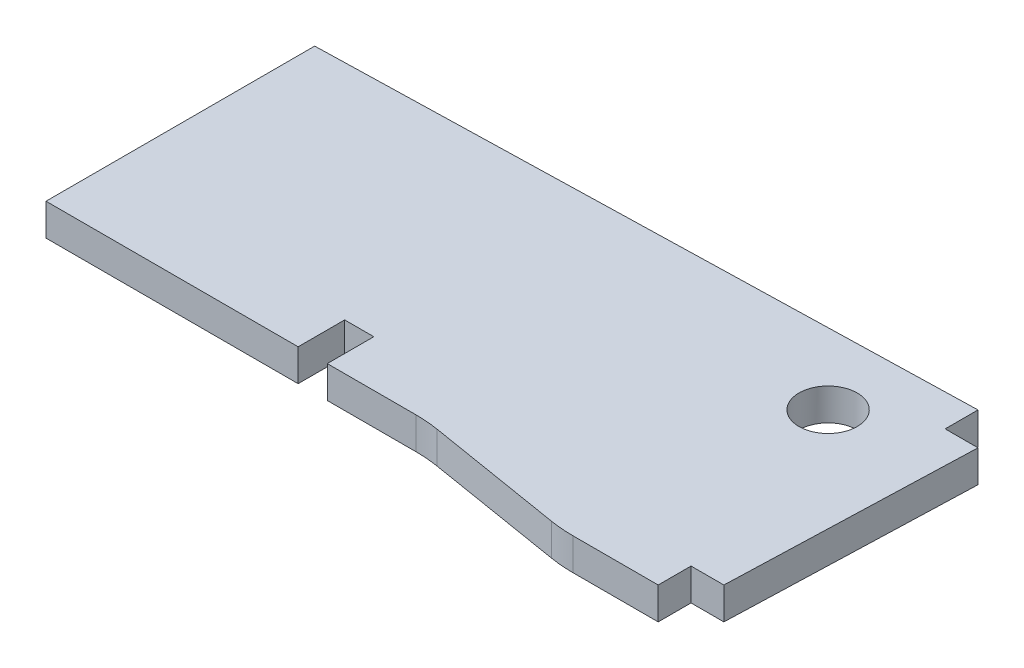
ISO-10303-21;
HEADER;
FILE_DESCRIPTION(('STEP AP214'),'2;1');
FILE_NAME('part.step','',(''),(''),'','','');
FILE_SCHEMA(('AUTOMOTIVE_DESIGN { 1 0 10303 214 1 1 1 1 }'));
ENDSEC;
DATA;
#1=APPLICATION_CONTEXT('core data for automotive mechanical design processes');
#2=APPLICATION_PROTOCOL_DEFINITION('international standard','automotive_design',2000,#1);
#3=PRODUCT_CONTEXT('',#1,'mechanical');
#4=PRODUCT('Part','Part','',(#3));
#5=PRODUCT_RELATED_PRODUCT_CATEGORY('part','',(#4));
#6=PRODUCT_DEFINITION_FORMATION('','',#4);
#7=PRODUCT_DEFINITION_CONTEXT('part definition',#1,'design');
#8=PRODUCT_DEFINITION('design','',#6,#7);
#9=PRODUCT_DEFINITION_SHAPE('','',#8);
#10=(LENGTH_UNIT() NAMED_UNIT(*) SI_UNIT(.MILLI.,.METRE.));
#11=(NAMED_UNIT(*) PLANE_ANGLE_UNIT() SI_UNIT($,.RADIAN.));
#12=(NAMED_UNIT(*) SI_UNIT($,.STERADIAN.) SOLID_ANGLE_UNIT());
#13=UNCERTAINTY_MEASURE_WITH_UNIT(LENGTH_MEASURE(1.E-05),#10,'distance_accuracy_value','');
#14=(GEOMETRIC_REPRESENTATION_CONTEXT(3) GLOBAL_UNCERTAINTY_ASSIGNED_CONTEXT((#13)) GLOBAL_UNIT_ASSIGNED_CONTEXT((#10,
#11,#12)) REPRESENTATION_CONTEXT('',''));
#15=CARTESIAN_POINT('',(0.,0.,0.));
#16=DIRECTION('',(0.,0.,1.));
#17=DIRECTION('',(1.,0.,0.));
#18=AXIS2_PLACEMENT_3D('',#15,#16,#17);
#19=CARTESIAN_POINT('',(0.,2.8448,0.));
#20=DIRECTION('',(0.,0.,-1.));
#21=DIRECTION('',(-1.,0.,0.));
#22=AXIS2_PLACEMENT_3D('',#19,#20,#21);
#23=PLANE('',#22);
#24=DIRECTION('',(1.,0.,0.));
#25=VECTOR('',#24,1.);
#26=CARTESIAN_POINT('',(0.,0.,0.));
#27=LINE('',#26,#25);
#28=CARTESIAN_POINT('',(0.,0.,0.));
#29=VERTEX_POINT('',#28);
#30=CARTESIAN_POINT('',(22.4282,0.,0.));
#31=VERTEX_POINT('',#30);
#32=EDGE_CURVE('E167',#29,#31,#27,.T.);
#33=ORIENTED_EDGE('',*,*,#32,.T.);
#34=DIRECTION('',(0.,1.,0.));
#35=VECTOR('',#34,1.);
#36=CARTESIAN_POINT('',(22.4282,-0.00100000000000013,0.));
#37=LINE('',#36,#35);
#38=CARTESIAN_POINT('',(22.4282,2.8448,0.));
#39=VERTEX_POINT('',#38);
#40=EDGE_CURVE('E148',#31,#39,#37,.T.);
#41=ORIENTED_EDGE('',*,*,#40,.T.);
#42=DIRECTION('',(1.,0.,0.));
#43=VECTOR('',#42,1.);
#44=CARTESIAN_POINT('',(0.,2.8448,0.));
#45=LINE('',#44,#43);
#46=CARTESIAN_POINT('',(0.,2.8448,0.));
#47=VERTEX_POINT('',#46);
#48=EDGE_CURVE('E249',#47,#39,#45,.T.);
#49=ORIENTED_EDGE('',*,*,#48,.F.);
#50=DIRECTION('',(0.,-1.,0.));
#51=VECTOR('',#50,1.);
#52=CARTESIAN_POINT('',(0.,2.8448,0.));
#53=LINE('',#52,#51);
#54=EDGE_CURVE('E173',#47,#29,#53,.T.);
#55=ORIENTED_EDGE('',*,*,#54,.T.);
#56=EDGE_LOOP('',(#33,#41,#49,#55));
#57=FACE_BOUND('',#56,.T.);
#58=ADVANCED_FACE('F36',(#57),#23,.F.);
#59=CARTESIAN_POINT('',(25.019,2.8448,0.));
#60=VERTEX_POINT('',#59);
#61=CARTESIAN_POINT('',(32.8981313310872,2.8448,0.));
#62=VERTEX_POINT('',#61);
#63=EDGE_CURVE('E58',#60,#62,#45,.T.);
#64=ORIENTED_EDGE('',*,*,#63,.F.);
#65=DIRECTION('',(0.,1.,0.));
#66=VECTOR('',#65,1.);
#67=CARTESIAN_POINT('',(25.019,-0.00100000000000013,0.));
#68=LINE('',#67,#66);
#69=CARTESIAN_POINT('',(25.019,0.,0.));
#70=VERTEX_POINT('',#69);
#71=EDGE_CURVE('E159',#70,#60,#68,.T.);
#72=ORIENTED_EDGE('',*,*,#71,.F.);
#73=CARTESIAN_POINT('',(32.8981313310872,0.,0.));
#74=VERTEX_POINT('',#73);
#75=EDGE_CURVE('E175',#70,#74,#27,.T.);
#76=ORIENTED_EDGE('',*,*,#75,.T.);
#77=DIRECTION('',(0.,-1.,0.));
#78=VECTOR('',#77,1.);
#79=CARTESIAN_POINT('',(32.8981313310872,2.8448,0.));
#80=LINE('',#79,#78);
#81=EDGE_CURVE('E234',#74,#62,#80,.F.);
#82=ORIENTED_EDGE('',*,*,#81,.T.);
#83=EDGE_LOOP('',(#64,#72,#76,#82));
#84=FACE_BOUND('',#83,.T.);
#85=ADVANCED_FACE('F243',(#84),#23,.F.);
#86=CARTESIAN_POINT('',(33.9344,2.8448,0.));
#87=DIRECTION('',(0.162112586908358,0.,-0.986772268137831));
#88=DIRECTION('',(-0.986772268137831,0.,-0.162112586908358));
#89=AXIS2_PLACEMENT_3D('',#86,#87,#88);
#90=PLANE('',#89);
#91=DIRECTION('',(0.986772268137831,0.,0.162112586908358));
#92=VECTOR('',#91,1.);
#93=CARTESIAN_POINT('',(33.9344,0.,0.));
#94=LINE('',#93,#92);
#95=CARTESIAN_POINT('',(34.9569611848233,0.,0.167992194649544));
#96=VERTEX_POINT('',#95);
#97=CARTESIAN_POINT('',(47.1358388151767,0.,2.16880780535046));
#98=VERTEX_POINT('',#97);
#99=EDGE_CURVE('E174',#96,#98,#94,.T.);
#100=ORIENTED_EDGE('',*,*,#99,.T.);
#101=DIRECTION('',(0.,-1.,0.));
#102=VECTOR('',#101,1.);
#103=CARTESIAN_POINT('',(47.1358388151767,2.8448,2.16880780535046));
#104=LINE('',#103,#102);
#105=CARTESIAN_POINT('',(47.1358388151767,2.8448,2.16880780535046));
#106=VERTEX_POINT('',#105);
#107=EDGE_CURVE('E230',#98,#106,#104,.F.);
#108=ORIENTED_EDGE('',*,*,#107,.T.);
#109=DIRECTION('',(0.986772268137831,0.,0.162112586908358));
#110=VECTOR('',#109,1.);
#111=CARTESIAN_POINT('',(33.9344,2.8448,0.));
#112=LINE('',#111,#110);
#113=CARTESIAN_POINT('',(34.9569611848233,2.8448,0.167992194649544));
#114=VERTEX_POINT('',#113);
#115=EDGE_CURVE('E251',#114,#106,#112,.T.);
#116=ORIENTED_EDGE('',*,*,#115,.F.);
#117=DIRECTION('',(0.,-1.,0.));
#118=VECTOR('',#117,1.);
#119=CARTESIAN_POINT('',(34.9569611848233,0.,0.167992194649544));
#120=LINE('',#119,#118);
#121=EDGE_CURVE('E227',#114,#96,#120,.T.);
#122=ORIENTED_EDGE('',*,*,#121,.T.);
#123=EDGE_LOOP('',(#100,#108,#116,#122));
#124=FACE_BOUND('',#123,.T.);
#125=ADVANCED_FACE('F312',(#124),#90,.F.);
#126=CARTESIAN_POINT('',(56.7944,2.8448,2.3368));
#127=DIRECTION('',(0.,0.,-1.));
#128=DIRECTION('',(-1.,0.,0.));
#129=AXIS2_PLACEMENT_3D('',#126,#127,#128);
#130=PLANE('',#129);
#131=DIRECTION('',(1.,0.,0.));
#132=VECTOR('',#131,1.);
#133=CARTESIAN_POINT('',(56.7944,2.8448,2.3368));
#134=LINE('',#133,#132);
#135=CARTESIAN_POINT('',(49.1946686689128,2.8448,2.33680000000001));
#136=VERTEX_POINT('',#135);
#137=CARTESIAN_POINT('',(56.7944,2.8448,2.3368));
#138=VERTEX_POINT('',#137);
#139=EDGE_CURVE('E254',#136,#138,#134,.T.);
#140=ORIENTED_EDGE('',*,*,#139,.F.);
#141=DIRECTION('',(0.,-1.,0.));
#142=VECTOR('',#141,1.);
#143=CARTESIAN_POINT('',(49.1946686689128,2.8448,2.33680000000001));
#144=LINE('',#143,#142);
#145=CARTESIAN_POINT('',(49.1946686689128,0.,2.33680000000001));
#146=VERTEX_POINT('',#145);
#147=EDGE_CURVE('E222',#136,#146,#144,.T.);
#148=ORIENTED_EDGE('',*,*,#147,.T.);
#149=DIRECTION('',(1.,0.,0.));
#150=VECTOR('',#149,1.);
#151=CARTESIAN_POINT('',(56.7944,0.,2.3368));
#152=LINE('',#151,#150);
#153=CARTESIAN_POINT('',(56.7944,0.,2.3368));
#154=VERTEX_POINT('',#153);
#155=EDGE_CURVE('E178',#146,#154,#152,.T.);
#156=ORIENTED_EDGE('',*,*,#155,.T.);
#157=DIRECTION('',(0.,-1.,0.));
#158=VECTOR('',#157,1.);
#159=CARTESIAN_POINT('',(56.7944,2.8448,2.3368));
#160=LINE('',#159,#158);
#161=EDGE_CURVE('E219',#138,#154,#160,.T.);
#162=ORIENTED_EDGE('',*,*,#161,.F.);
#163=EDGE_LOOP('',(#140,#148,#156,#162));
#164=FACE_BOUND('',#163,.T.);
#165=ADVANCED_FACE('F304',(#164),#130,.F.);
#166=CARTESIAN_POINT('',(56.7944,2.8448,-0.584199999999996));
#167=DIRECTION('',(-1.,0.,0.));
#168=DIRECTION('',(0.,0.,1.));
#169=AXIS2_PLACEMENT_3D('',#166,#167,#168);
#170=PLANE('',#169);
#171=DIRECTION('',(0.,0.,-1.));
#172=VECTOR('',#171,1.);
#173=CARTESIAN_POINT('',(56.7944,0.,-0.584199999999996));
#174=LINE('',#173,#172);
#175=CARTESIAN_POINT('',(56.7944,0.,-0.584199999999996));
#176=VERTEX_POINT('',#175);
#177=EDGE_CURVE('E186',#154,#176,#174,.T.);
#178=ORIENTED_EDGE('',*,*,#177,.T.);
#179=DIRECTION('',(0.,-1.,0.));
#180=VECTOR('',#179,1.);
#181=CARTESIAN_POINT('',(56.7944,2.8448,-0.584199999999996));
#182=LINE('',#181,#180);
#183=CARTESIAN_POINT('',(56.7944,2.8448,-0.584199999999996));
#184=VERTEX_POINT('',#183);
#185=EDGE_CURVE('E216',#184,#176,#182,.T.);
#186=ORIENTED_EDGE('',*,*,#185,.F.);
#187=DIRECTION('',(0.,0.,-1.));
#188=VECTOR('',#187,1.);
#189=CARTESIAN_POINT('',(56.7944,2.8448,-0.584199999999996));
#190=LINE('',#189,#188);
#191=EDGE_CURVE('E256',#138,#184,#190,.T.);
#192=ORIENTED_EDGE('',*,*,#191,.F.);
#193=ORIENTED_EDGE('',*,*,#161,.T.);
#194=EDGE_LOOP('',(#178,#186,#192,#193));
#195=FACE_BOUND('',#194,.T.);
#196=ADVANCED_FACE('F299',(#195),#170,.F.);
#197=CARTESIAN_POINT('',(59.7154,2.8448,-0.584199999999996));
#198=DIRECTION('',(0.,0.,-1.));
#199=DIRECTION('',(-1.,0.,0.));
#200=AXIS2_PLACEMENT_3D('',#197,#198,#199);
#201=PLANE('',#200);
#202=DIRECTION('',(1.,0.,0.));
#203=VECTOR('',#202,1.);
#204=CARTESIAN_POINT('',(59.7154,0.,-0.584199999999996));
#205=LINE('',#204,#203);
#206=CARTESIAN_POINT('',(59.7154,0.,-0.584199999999996));
#207=VERTEX_POINT('',#206);
#208=EDGE_CURVE('E188',#176,#207,#205,.T.);
#209=ORIENTED_EDGE('',*,*,#208,.T.);
#210=DIRECTION('',(0.,-1.,0.));
#211=VECTOR('',#210,1.);
#212=CARTESIAN_POINT('',(59.7154,2.8448,-0.584199999999996));
#213=LINE('',#212,#211);
#214=CARTESIAN_POINT('',(59.7154,2.8448,-0.584199999999996));
#215=VERTEX_POINT('',#214);
#216=EDGE_CURVE('E213',#215,#207,#213,.T.);
#217=ORIENTED_EDGE('',*,*,#216,.F.);
#218=DIRECTION('',(1.,0.,0.));
#219=VECTOR('',#218,1.);
#220=CARTESIAN_POINT('',(59.7154,2.8448,-0.584199999999996));
#221=LINE('',#220,#219);
#222=EDGE_CURVE('E258',#184,#215,#221,.T.);
#223=ORIENTED_EDGE('',*,*,#222,.F.);
#224=ORIENTED_EDGE('',*,*,#185,.T.);
#225=EDGE_LOOP('',(#209,#217,#223,#224));
#226=FACE_BOUND('',#225,.T.);
#227=ADVANCED_FACE('F295',(#226),#201,.F.);
#228=CARTESIAN_POINT('',(60.452,2.8448,-22.4536));
#229=DIRECTION('',(-0.999433251510255,0.,-0.0336626762994164));
#230=DIRECTION('',(-0.0336626762994164,0.,0.999433251510255));
#231=AXIS2_PLACEMENT_3D('',#228,#229,#230);
#232=PLANE('',#231);
#233=DIRECTION('',(0.0336626762994164,0.,-0.999433251510255));
#234=VECTOR('',#233,1.);
#235=CARTESIAN_POINT('',(60.452,0.,-22.4536));
#236=LINE('',#235,#234);
#237=CARTESIAN_POINT('',(60.452,0.,-22.4536));
#238=VERTEX_POINT('',#237);
#239=EDGE_CURVE('E190',#207,#238,#236,.T.);
#240=ORIENTED_EDGE('',*,*,#239,.T.);
#241=DIRECTION('',(0.,-1.,0.));
#242=VECTOR('',#241,1.);
#243=CARTESIAN_POINT('',(60.452,2.8448,-22.4536));
#244=LINE('',#243,#242);
#245=CARTESIAN_POINT('',(60.452,2.8448,-22.4536));
#246=VERTEX_POINT('',#245);
#247=EDGE_CURVE('E210',#246,#238,#244,.T.);
#248=ORIENTED_EDGE('',*,*,#247,.F.);
#249=DIRECTION('',(0.0336626762994164,0.,-0.999433251510255));
#250=VECTOR('',#249,1.);
#251=CARTESIAN_POINT('',(60.452,2.8448,-22.4536));
#252=LINE('',#251,#250);
#253=EDGE_CURVE('E260',#215,#246,#252,.T.);
#254=ORIENTED_EDGE('',*,*,#253,.F.);
#255=ORIENTED_EDGE('',*,*,#216,.T.);
#256=EDGE_LOOP('',(#240,#248,#254,#255));
#257=FACE_BOUND('',#256,.T.);
#258=ADVANCED_FACE('F290',(#257),#232,.F.);
#259=CARTESIAN_POINT('',(57.531,2.8448,-22.4536));
#260=DIRECTION('',(0.,0.,1.));
#261=DIRECTION('',(1.,0.,0.));
#262=AXIS2_PLACEMENT_3D('',#259,#260,#261);
#263=PLANE('',#262);
#264=DIRECTION('',(-1.,0.,0.));
#265=VECTOR('',#264,1.);
#266=CARTESIAN_POINT('',(57.531,0.,-22.4536));
#267=LINE('',#266,#265);
#268=CARTESIAN_POINT('',(57.531,0.,-22.4536));
#269=VERTEX_POINT('',#268);
#270=EDGE_CURVE('E192',#238,#269,#267,.T.);
#271=ORIENTED_EDGE('',*,*,#270,.T.);
#272=DIRECTION('',(0.,-1.,0.));
#273=VECTOR('',#272,1.);
#274=CARTESIAN_POINT('',(57.531,2.8448,-22.4536));
#275=LINE('',#274,#273);
#276=CARTESIAN_POINT('',(57.531,2.8448,-22.4536));
#277=VERTEX_POINT('',#276);
#278=EDGE_CURVE('E207',#277,#269,#275,.T.);
#279=ORIENTED_EDGE('',*,*,#278,.F.);
#280=DIRECTION('',(-1.,0.,0.));
#281=VECTOR('',#280,1.);
#282=CARTESIAN_POINT('',(57.531,2.8448,-22.4536));
#283=LINE('',#282,#281);
#284=EDGE_CURVE('E262',#246,#277,#283,.T.);
#285=ORIENTED_EDGE('',*,*,#284,.F.);
#286=ORIENTED_EDGE('',*,*,#247,.T.);
#287=EDGE_LOOP('',(#271,#279,#285,#286));
#288=FACE_BOUND('',#287,.T.);
#289=ADVANCED_FACE('F284',(#288),#263,.F.);
#290=CARTESIAN_POINT('',(57.531,2.8448,-25.3746));
#291=DIRECTION('',(-1.,0.,0.));
#292=DIRECTION('',(0.,0.,1.));
#293=AXIS2_PLACEMENT_3D('',#290,#291,#292);
#294=PLANE('',#293);
#295=DIRECTION('',(0.,0.,-1.));
#296=VECTOR('',#295,1.);
#297=CARTESIAN_POINT('',(57.531,0.,-25.3746));
#298=LINE('',#297,#296);
#299=CARTESIAN_POINT('',(57.531,0.,-25.3746));
#300=VERTEX_POINT('',#299);
#301=EDGE_CURVE('E194',#269,#300,#298,.T.);
#302=ORIENTED_EDGE('',*,*,#301,.T.);
#303=DIRECTION('',(0.,-1.,0.));
#304=VECTOR('',#303,1.);
#305=CARTESIAN_POINT('',(57.531,2.8448,-25.3746));
#306=LINE('',#305,#304);
#307=CARTESIAN_POINT('',(57.531,2.8448,-25.3746));
#308=VERTEX_POINT('',#307);
#309=EDGE_CURVE('E204',#308,#300,#306,.T.);
#310=ORIENTED_EDGE('',*,*,#309,.F.);
#311=DIRECTION('',(0.,0.,-1.));
#312=VECTOR('',#311,1.);
#313=CARTESIAN_POINT('',(57.531,2.8448,-25.3746));
#314=LINE('',#313,#312);
#315=EDGE_CURVE('E264',#277,#308,#314,.T.);
#316=ORIENTED_EDGE('',*,*,#315,.F.);
#317=ORIENTED_EDGE('',*,*,#278,.T.);
#318=EDGE_LOOP('',(#302,#310,#316,#317));
#319=FACE_BOUND('',#318,.T.);
#320=ADVANCED_FACE('F280',(#319),#294,.F.);
#321=CARTESIAN_POINT('',(0.,2.8448,-23.9014));
#322=DIRECTION('',(0.0255986725901374,0.,0.999672300287261));
#323=DIRECTION('',(0.999672300287261,0.,-0.0255986725901374));
#324=AXIS2_PLACEMENT_3D('',#321,#322,#323);
#325=PLANE('',#324);
#326=DIRECTION('',(-0.999672300287261,0.,0.0255986725901374));
#327=VECTOR('',#326,1.);
#328=CARTESIAN_POINT('',(0.,0.,-23.9014));
#329=LINE('',#328,#327);
#330=CARTESIAN_POINT('',(0.,0.,-23.9014));
#331=VERTEX_POINT('',#330);
#332=EDGE_CURVE('E196',#300,#331,#329,.T.);
#333=ORIENTED_EDGE('',*,*,#332,.T.);
#334=DIRECTION('',(0.,-1.,0.));
#335=VECTOR('',#334,1.);
#336=CARTESIAN_POINT('',(0.,2.8448,-23.9014));
#337=LINE('',#336,#335);
#338=CARTESIAN_POINT('',(0.,2.8448,-23.9014));
#339=VERTEX_POINT('',#338);
#340=EDGE_CURVE('E201',#339,#331,#337,.T.);
#341=ORIENTED_EDGE('',*,*,#340,.F.);
#342=DIRECTION('',(-0.999672300287261,0.,0.0255986725901374));
#343=VECTOR('',#342,1.);
#344=CARTESIAN_POINT('',(0.,2.8448,-23.9014));
#345=LINE('',#344,#343);
#346=EDGE_CURVE('E265',#308,#339,#345,.T.);
#347=ORIENTED_EDGE('',*,*,#346,.F.);
#348=ORIENTED_EDGE('',*,*,#309,.T.);
#349=EDGE_LOOP('',(#333,#341,#347,#348));
#350=FACE_BOUND('',#349,.T.);
#351=ADVANCED_FACE('F276',(#350),#325,.F.);
#352=CARTESIAN_POINT('',(0.,2.8448,0.));
#353=DIRECTION('',(1.,0.,0.));
#354=DIRECTION('',(0.,0.,-1.));
#355=AXIS2_PLACEMENT_3D('',#352,#353,#354);
#356=PLANE('',#355);
#357=DIRECTION('',(0.,0.,1.));
#358=VECTOR('',#357,1.);
#359=CARTESIAN_POINT('',(0.,0.,0.));
#360=LINE('',#359,#358);
#361=EDGE_CURVE('E198',#331,#29,#360,.T.);
#362=ORIENTED_EDGE('',*,*,#361,.T.);
#363=ORIENTED_EDGE('',*,*,#54,.F.);
#364=DIRECTION('',(0.,0.,1.));
#365=VECTOR('',#364,1.);
#366=CARTESIAN_POINT('',(0.,2.8448,0.));
#367=LINE('',#366,#365);
#368=EDGE_CURVE('E182',#339,#47,#367,.T.);
#369=ORIENTED_EDGE('',*,*,#368,.F.);
#370=ORIENTED_EDGE('',*,*,#340,.T.);
#371=EDGE_LOOP('',(#362,#363,#369,#370));
#372=FACE_BOUND('',#371,.T.);
#373=ADVANCED_FACE('F271',(#372),#356,.F.);
#374=CARTESIAN_POINT('',(0.,2.8448,0.));
#375=DIRECTION('',(0.,-1.,0.));
#376=DIRECTION('',(0.,0.,-1.));
#377=AXIS2_PLACEMENT_3D('',#374,#375,#376);
#378=PLANE('',#377);
#379=CARTESIAN_POINT('',(50.8508,2.8448,-18.7198));
#380=DIRECTION('',(0.,1.,0.));
#381=DIRECTION('',(0.,0.,1.));
#382=AXIS2_PLACEMENT_3D('',#379,#380,#381);
#383=CIRCLE('',#382,2.59079999999999);
#384=CARTESIAN_POINT('',(50.8508,2.8448,-16.129));
#385=VERTEX_POINT('',#384);
#386=EDGE_CURVE('E480',#385,#385,#383,.T.);
#387=ORIENTED_EDGE('',*,*,#386,.F.);
#388=EDGE_LOOP('',(#387));
#389=FACE_BOUND('',#388,.T.);
#390=ORIENTED_EDGE('',*,*,#48,.T.);
#391=DIRECTION('',(0.,0.,1.));
#392=VECTOR('',#391,1.);
#393=CARTESIAN_POINT('',(22.4282,2.8448,0.));
#394=LINE('',#393,#392);
#395=CARTESIAN_POINT('',(22.4282,2.8448,-4.1402));
#396=VERTEX_POINT('',#395);
#397=EDGE_CURVE('E154',#396,#39,#394,.T.);
#398=ORIENTED_EDGE('',*,*,#397,.F.);
#399=DIRECTION('',(-1.,0.,0.));
#400=VECTOR('',#399,1.);
#401=CARTESIAN_POINT('',(22.4282,2.8448,-4.1402));
#402=LINE('',#401,#400);
#403=CARTESIAN_POINT('',(25.019,2.8448,-4.1402));
#404=VERTEX_POINT('',#403);
#405=EDGE_CURVE('E160',#404,#396,#402,.T.);
#406=ORIENTED_EDGE('',*,*,#405,.F.);
#407=DIRECTION('',(0.,0.,-1.));
#408=VECTOR('',#407,1.);
#409=CARTESIAN_POINT('',(25.019,2.8448,0.));
#410=LINE('',#409,#408);
#411=EDGE_CURVE('E472',#60,#404,#410,.T.);
#412=ORIENTED_EDGE('',*,*,#411,.F.);
#413=ORIENTED_EDGE('',*,*,#63,.T.);
#414=CARTESIAN_POINT('',(32.8981313310872,2.8448,12.7));
#415=DIRECTION('',(0.,-1.,0.));
#416=DIRECTION('',(0.,0.,-1.));
#417=AXIS2_PLACEMENT_3D('',#414,#415,#416);
#418=CIRCLE('',#417,12.7);
#419=EDGE_CURVE('E11',#62,#114,#418,.T.);
#420=ORIENTED_EDGE('',*,*,#419,.T.);
#421=ORIENTED_EDGE('',*,*,#115,.T.);
#422=CARTESIAN_POINT('',(49.1946686689128,2.8448,-10.3632));
#423=DIRECTION('',(0.,-1.,0.));
#424=DIRECTION('',(0.,0.,-1.));
#425=AXIS2_PLACEMENT_3D('',#422,#423,#424);
#426=CIRCLE('',#425,12.7);
#427=EDGE_CURVE('E232',#106,#136,#426,.F.);
#428=ORIENTED_EDGE('',*,*,#427,.T.);
#429=ORIENTED_EDGE('',*,*,#139,.T.);
#430=ORIENTED_EDGE('',*,*,#191,.T.);
#431=ORIENTED_EDGE('',*,*,#222,.T.);
#432=ORIENTED_EDGE('',*,*,#253,.T.);
#433=ORIENTED_EDGE('',*,*,#284,.T.);
#434=ORIENTED_EDGE('',*,*,#315,.T.);
#435=ORIENTED_EDGE('',*,*,#346,.T.);
#436=ORIENTED_EDGE('',*,*,#368,.T.);
#437=EDGE_LOOP('',(#390,#398,#406,#412,#413,#420,#421,#428,#429,#430,#431,#432,#433,#434,#435,#436));
#438=FACE_BOUND('',#437,.T.);
#439=ADVANCED_FACE('F269',(#389,#438),#378,.F.);
#440=CARTESIAN_POINT('',(0.,0.,0.));
#441=DIRECTION('',(0.,-1.,0.));
#442=DIRECTION('',(0.,0.,-1.));
#443=AXIS2_PLACEMENT_3D('',#440,#441,#442);
#444=PLANE('',#443);
#445=CARTESIAN_POINT('',(50.8508,0.,-18.7198));
#446=DIRECTION('',(0.,-1.,0.));
#447=DIRECTION('',(0.,0.,-1.));
#448=AXIS2_PLACEMENT_3D('',#445,#446,#447);
#449=CIRCLE('',#448,2.59079999999999);
#450=CARTESIAN_POINT('',(50.8508,0.,-21.3106));
#451=VERTEX_POINT('',#450);
#452=EDGE_CURVE('E481',#451,#451,#449,.F.);
#453=ORIENTED_EDGE('',*,*,#452,.T.);
#454=EDGE_LOOP('',(#453));
#455=FACE_BOUND('',#454,.T.);
#456=DIRECTION('',(0.,0.,1.));
#457=VECTOR('',#456,1.);
#458=CARTESIAN_POINT('',(22.4282,0.,0.));
#459=LINE('',#458,#457);
#460=CARTESIAN_POINT('',(22.4282,0.,-4.1402));
#461=VERTEX_POINT('',#460);
#462=EDGE_CURVE('E151',#461,#31,#459,.T.);
#463=ORIENTED_EDGE('',*,*,#462,.T.);
#464=ORIENTED_EDGE('',*,*,#32,.F.);
#465=ORIENTED_EDGE('',*,*,#361,.F.);
#466=ORIENTED_EDGE('',*,*,#332,.F.);
#467=ORIENTED_EDGE('',*,*,#301,.F.);
#468=ORIENTED_EDGE('',*,*,#270,.F.);
#469=ORIENTED_EDGE('',*,*,#239,.F.);
#470=ORIENTED_EDGE('',*,*,#208,.F.);
#471=ORIENTED_EDGE('',*,*,#177,.F.);
#472=ORIENTED_EDGE('',*,*,#155,.F.);
#473=CARTESIAN_POINT('',(49.1946686689128,0.,-10.3632));
#474=DIRECTION('',(0.,-1.,0.));
#475=DIRECTION('',(0.,0.,-1.));
#476=AXIS2_PLACEMENT_3D('',#473,#474,#475);
#477=CIRCLE('',#476,12.7);
#478=EDGE_CURVE('E225',#146,#98,#477,.T.);
#479=ORIENTED_EDGE('',*,*,#478,.T.);
#480=ORIENTED_EDGE('',*,*,#99,.F.);
#481=CARTESIAN_POINT('',(32.8981313310872,0.,12.7));
#482=DIRECTION('',(0.,-1.,0.));
#483=DIRECTION('',(0.,0.,-1.));
#484=AXIS2_PLACEMENT_3D('',#481,#482,#483);
#485=CIRCLE('',#484,12.7);
#486=EDGE_CURVE('E44',#96,#74,#485,.F.);
#487=ORIENTED_EDGE('',*,*,#486,.T.);
#488=ORIENTED_EDGE('',*,*,#75,.F.);
#489=DIRECTION('',(0.,0.,-1.));
#490=VECTOR('',#489,1.);
#491=CARTESIAN_POINT('',(25.019,0.,0.));
#492=LINE('',#491,#490);
#493=CARTESIAN_POINT('',(25.019,0.,-4.1402));
#494=VERTEX_POINT('',#493);
#495=EDGE_CURVE('E478',#70,#494,#492,.T.);
#496=ORIENTED_EDGE('',*,*,#495,.T.);
#497=DIRECTION('',(-1.,0.,0.));
#498=VECTOR('',#497,1.);
#499=CARTESIAN_POINT('',(22.4282,0.,-4.1402));
#500=LINE('',#499,#498);
#501=EDGE_CURVE('E169',#494,#461,#500,.T.);
#502=ORIENTED_EDGE('',*,*,#501,.T.);
#503=EDGE_LOOP('',(#463,#464,#465,#466,#467,#468,#469,#470,#471,#472,#479,#480,#487,#488,#496,#502));
#504=FACE_BOUND('',#503,.T.);
#505=ADVANCED_FACE('F165',(#455,#504),#444,.T.);
#506=CARTESIAN_POINT('',(49.1946686689128,2.8448,-10.3632));
#507=DIRECTION('',(0.,-1.,0.));
#508=DIRECTION('',(0.,0.,-1.));
#509=AXIS2_PLACEMENT_3D('',#506,#507,#508);
#510=CYLINDRICAL_SURFACE('',#509,12.7);
#511=ORIENTED_EDGE('',*,*,#427,.F.);
#512=ORIENTED_EDGE('',*,*,#107,.F.);
#513=ORIENTED_EDGE('',*,*,#478,.F.);
#514=ORIENTED_EDGE('',*,*,#147,.F.);
#515=EDGE_LOOP('',(#511,#512,#513,#514));
#516=FACE_BOUND('',#515,.T.);
#517=ADVANCED_FACE('F308',(#516),#510,.T.);
#518=CARTESIAN_POINT('',(32.8981313310872,2.8448,12.7));
#519=DIRECTION('',(0.,1.,0.));
#520=DIRECTION('',(0.,0.,1.));
#521=AXIS2_PLACEMENT_3D('',#518,#519,#520);
#522=CYLINDRICAL_SURFACE('',#521,12.7);
#523=ORIENTED_EDGE('',*,*,#419,.F.);
#524=ORIENTED_EDGE('',*,*,#81,.F.);
#525=ORIENTED_EDGE('',*,*,#486,.F.);
#526=ORIENTED_EDGE('',*,*,#121,.F.);
#527=EDGE_LOOP('',(#523,#524,#525,#526));
#528=FACE_BOUND('',#527,.T.);
#529=ADVANCED_FACE('F38',(#528),#522,.F.);
#530=CARTESIAN_POINT('',(22.4282,-0.00100000000000013,0.));
#531=DIRECTION('',(-1.,0.,0.));
#532=DIRECTION('',(0.,0.,1.));
#533=AXIS2_PLACEMENT_3D('',#530,#531,#532);
#534=PLANE('',#533);
#535=DIRECTION('',(0.,1.,0.));
#536=VECTOR('',#535,1.);
#537=CARTESIAN_POINT('',(22.4282,-0.00100000000000013,-4.1402));
#538=LINE('',#537,#536);
#539=EDGE_CURVE('E180',#461,#396,#538,.T.);
#540=ORIENTED_EDGE('',*,*,#539,.T.);
#541=ORIENTED_EDGE('',*,*,#397,.T.);
#542=ORIENTED_EDGE('',*,*,#40,.F.);
#543=ORIENTED_EDGE('',*,*,#462,.F.);
#544=EDGE_LOOP('',(#540,#541,#542,#543));
#545=FACE_BOUND('',#544,.T.);
#546=ADVANCED_FACE('F150',(#545),#534,.F.);
#547=CARTESIAN_POINT('',(22.4282,-0.00100000000000013,-4.1402));
#548=DIRECTION('',(0.,0.,-1.));
#549=DIRECTION('',(-1.,0.,0.));
#550=AXIS2_PLACEMENT_3D('',#547,#548,#549);
#551=PLANE('',#550);
#552=DIRECTION('',(0.,1.,0.));
#553=VECTOR('',#552,1.);
#554=CARTESIAN_POINT('',(25.019,-0.00100000000000013,-4.1402));
#555=LINE('',#554,#553);
#556=EDGE_CURVE('E51',#494,#404,#555,.T.);
#557=ORIENTED_EDGE('',*,*,#556,.T.);
#558=ORIENTED_EDGE('',*,*,#405,.T.);
#559=ORIENTED_EDGE('',*,*,#539,.F.);
#560=ORIENTED_EDGE('',*,*,#501,.F.);
#561=EDGE_LOOP('',(#557,#558,#559,#560));
#562=FACE_BOUND('',#561,.T.);
#563=ADVANCED_FACE('F411',(#562),#551,.F.);
#564=CARTESIAN_POINT('',(25.019,-0.00100000000000013,0.));
#565=DIRECTION('',(1.,0.,0.));
#566=DIRECTION('',(0.,0.,-1.));
#567=AXIS2_PLACEMENT_3D('',#564,#565,#566);
#568=PLANE('',#567);
#569=ORIENTED_EDGE('',*,*,#71,.T.);
#570=ORIENTED_EDGE('',*,*,#411,.T.);
#571=ORIENTED_EDGE('',*,*,#556,.F.);
#572=ORIENTED_EDGE('',*,*,#495,.F.);
#573=EDGE_LOOP('',(#569,#570,#571,#572));
#574=FACE_BOUND('',#573,.T.);
#575=ADVANCED_FACE('F390',(#574),#568,.F.);
#576=CARTESIAN_POINT('',(50.8508,-0.00100000000000013,-18.7198));
#577=DIRECTION('',(0.,1.,0.));
#578=DIRECTION('',(0.,0.,1.));
#579=AXIS2_PLACEMENT_3D('',#576,#577,#578);
#580=CYLINDRICAL_SURFACE('',#579,2.59079999999999);
#581=ORIENTED_EDGE('',*,*,#452,.F.);
#582=EDGE_LOOP('',(#581));
#583=FACE_BOUND('',#582,.T.);
#584=ORIENTED_EDGE('',*,*,#386,.T.);
#585=EDGE_LOOP('',(#584));
#586=FACE_BOUND('',#585,.T.);
#587=ADVANCED_FACE('F400',(#583,#586),#580,.F.);
#588=CLOSED_SHELL('',(#58,#85,#125,#165,#196,#227,#258,#289,#320,#351,#373,#439,#505,#517,#529,
#546,#563,#575,#587));
#589=MANIFOLD_SOLID_BREP('B2',#588);
#590=ADVANCED_BREP_SHAPE_REPRESENTATION('',(#18,#589),#14);
#591=SHAPE_DEFINITION_REPRESENTATION(#9,#590);
ENDSEC;
END-ISO-10303-21;
